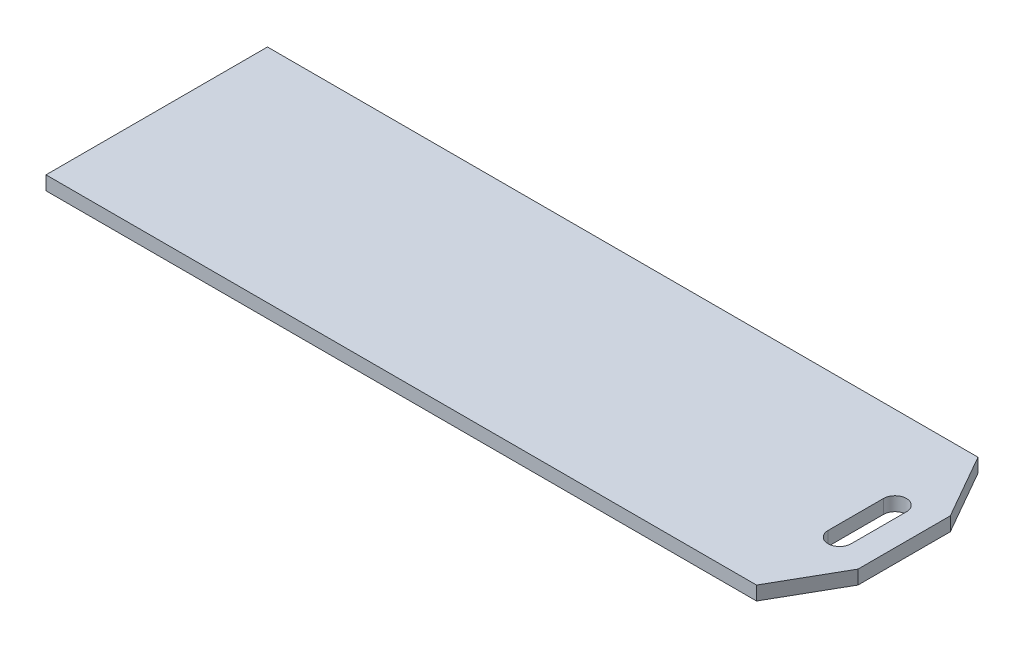
ISO-10303-21;
HEADER;
FILE_DESCRIPTION(('STEP AP214'),'2;1');
FILE_NAME('part.step','',(''),(''),'','','');
FILE_SCHEMA(('AUTOMOTIVE_DESIGN { 1 0 10303 214 1 1 1 1 }'));
ENDSEC;
DATA;
#1=APPLICATION_CONTEXT('core data for automotive mechanical design processes');
#2=APPLICATION_PROTOCOL_DEFINITION('international standard','automotive_design',2000,#1);
#3=PRODUCT_CONTEXT('',#1,'mechanical');
#4=PRODUCT('Part','Part','',(#3));
#5=PRODUCT_RELATED_PRODUCT_CATEGORY('part','',(#4));
#6=PRODUCT_DEFINITION_FORMATION('','',#4);
#7=PRODUCT_DEFINITION_CONTEXT('part definition',#1,'design');
#8=PRODUCT_DEFINITION('design','',#6,#7);
#9=PRODUCT_DEFINITION_SHAPE('','',#8);
#10=(LENGTH_UNIT() NAMED_UNIT(*) SI_UNIT(.MILLI.,.METRE.));
#11=(NAMED_UNIT(*) PLANE_ANGLE_UNIT() SI_UNIT($,.RADIAN.));
#12=(NAMED_UNIT(*) SI_UNIT($,.STERADIAN.) SOLID_ANGLE_UNIT());
#13=UNCERTAINTY_MEASURE_WITH_UNIT(LENGTH_MEASURE(1.E-05),#10,'distance_accuracy_value','');
#14=(GEOMETRIC_REPRESENTATION_CONTEXT(3) GLOBAL_UNCERTAINTY_ASSIGNED_CONTEXT((#13)) GLOBAL_UNIT_ASSIGNED_CONTEXT((#10,
#11,#12)) REPRESENTATION_CONTEXT('',''));
#15=CARTESIAN_POINT('',(0.,0.,0.));
#16=DIRECTION('',(0.,0.,1.));
#17=DIRECTION('',(1.,0.,0.));
#18=AXIS2_PLACEMENT_3D('',#15,#16,#17);
#19=CARTESIAN_POINT('',(0.,19.05,0.));
#20=DIRECTION('',(1.,0.,0.));
#21=DIRECTION('',(0.,0.,-1.));
#22=AXIS2_PLACEMENT_3D('',#19,#20,#21);
#23=PLANE('',#22);
#24=DIRECTION('',(0.,0.,1.));
#25=VECTOR('',#24,1.);
#26=CARTESIAN_POINT('',(0.,0.,0.));
#27=LINE('',#26,#25);
#28=CARTESIAN_POINT('',(0.,0.,0.));
#29=VERTEX_POINT('',#28);
#30=CARTESIAN_POINT('',(0.,0.,304.8));
#31=VERTEX_POINT('',#30);
#32=EDGE_CURVE('E146',#29,#31,#27,.T.);
#33=ORIENTED_EDGE('',*,*,#32,.T.);
#34=DIRECTION('',(0.,-1.,0.));
#35=VECTOR('',#34,1.);
#36=CARTESIAN_POINT('',(0.,19.05,304.8));
#37=LINE('',#36,#35);
#38=CARTESIAN_POINT('',(0.,19.05,304.8));
#39=VERTEX_POINT('',#38);
#40=EDGE_CURVE('E11',#39,#31,#37,.T.);
#41=ORIENTED_EDGE('',*,*,#40,.F.);
#42=DIRECTION('',(0.,0.,1.));
#43=VECTOR('',#42,1.);
#44=CARTESIAN_POINT('',(0.,19.05,0.));
#45=LINE('',#44,#43);
#46=CARTESIAN_POINT('',(0.,19.05,0.));
#47=VERTEX_POINT('',#46);
#48=EDGE_CURVE('E155',#47,#39,#45,.T.);
#49=ORIENTED_EDGE('',*,*,#48,.F.);
#50=DIRECTION('',(0.,-1.,0.));
#51=VECTOR('',#50,1.);
#52=CARTESIAN_POINT('',(0.,19.05,0.));
#53=LINE('',#52,#51);
#54=EDGE_CURVE('E167',#47,#29,#53,.T.);
#55=ORIENTED_EDGE('',*,*,#54,.T.);
#56=EDGE_LOOP('',(#33,#41,#49,#55));
#57=FACE_BOUND('',#56,.T.);
#58=ADVANCED_FACE('F39',(#57),#23,.F.);
#59=CARTESIAN_POINT('',(0.,19.05,304.8));
#60=DIRECTION('',(0.,0.,-1.));
#61=DIRECTION('',(-1.,0.,0.));
#62=AXIS2_PLACEMENT_3D('',#59,#60,#61);
#63=PLANE('',#62);
#64=DIRECTION('',(1.,0.,0.));
#65=VECTOR('',#64,1.);
#66=CARTESIAN_POINT('',(0.,0.,304.8));
#67=LINE('',#66,#65);
#68=CARTESIAN_POINT('',(977.9,0.,304.8));
#69=VERTEX_POINT('',#68);
#70=EDGE_CURVE('E166',#31,#69,#67,.T.);
#71=ORIENTED_EDGE('',*,*,#70,.T.);
#72=DIRECTION('',(0.,-1.,0.));
#73=VECTOR('',#72,1.);
#74=CARTESIAN_POINT('',(977.9,19.05,304.8));
#75=LINE('',#74,#73);
#76=CARTESIAN_POINT('',(977.9,19.05,304.8));
#77=VERTEX_POINT('',#76);
#78=EDGE_CURVE('E46',#77,#69,#75,.T.);
#79=ORIENTED_EDGE('',*,*,#78,.F.);
#80=DIRECTION('',(1.,0.,0.));
#81=VECTOR('',#80,1.);
#82=CARTESIAN_POINT('',(0.,19.05,304.8));
#83=LINE('',#82,#81);
#84=EDGE_CURVE('E154',#39,#77,#83,.T.);
#85=ORIENTED_EDGE('',*,*,#84,.F.);
#86=ORIENTED_EDGE('',*,*,#40,.T.);
#87=EDGE_LOOP('',(#71,#79,#85,#86));
#88=FACE_BOUND('',#87,.T.);
#89=ADVANCED_FACE('F212',(#88),#63,.F.);
#90=CARTESIAN_POINT('',(1028.7,19.05,215.9));
#91=DIRECTION('',(-0.868243142124459,0.,-0.496138938356833));
#92=DIRECTION('',(-0.496138938356833,0.,0.86824314212446));
#93=AXIS2_PLACEMENT_3D('',#90,#91,#92);
#94=PLANE('',#93);
#95=DIRECTION('',(0.496138938356833,0.,-0.868243142124459));
#96=VECTOR('',#95,1.);
#97=CARTESIAN_POINT('',(1028.7,0.,215.9));
#98=LINE('',#97,#96);
#99=CARTESIAN_POINT('',(1028.7,0.,215.9));
#100=VERTEX_POINT('',#99);
#101=EDGE_CURVE('E172',#69,#100,#98,.T.);
#102=ORIENTED_EDGE('',*,*,#101,.T.);
#103=DIRECTION('',(0.,-1.,0.));
#104=VECTOR('',#103,1.);
#105=CARTESIAN_POINT('',(1028.7,19.05,215.9));
#106=LINE('',#105,#104);
#107=CARTESIAN_POINT('',(1028.7,19.05,215.9));
#108=VERTEX_POINT('',#107);
#109=EDGE_CURVE('E187',#108,#100,#106,.T.);
#110=ORIENTED_EDGE('',*,*,#109,.F.);
#111=DIRECTION('',(0.496138938356833,0.,-0.868243142124459));
#112=VECTOR('',#111,1.);
#113=CARTESIAN_POINT('',(1028.7,19.05,215.9));
#114=LINE('',#113,#112);
#115=EDGE_CURVE('E158',#77,#108,#114,.T.);
#116=ORIENTED_EDGE('',*,*,#115,.F.);
#117=ORIENTED_EDGE('',*,*,#78,.T.);
#118=EDGE_LOOP('',(#102,#110,#116,#117));
#119=FACE_BOUND('',#118,.T.);
#120=ADVANCED_FACE('F192',(#119),#94,.F.);
#121=CARTESIAN_POINT('',(1028.7,19.05,88.9));
#122=DIRECTION('',(-1.,0.,0.));
#123=DIRECTION('',(0.,0.,1.));
#124=AXIS2_PLACEMENT_3D('',#121,#122,#123);
#125=PLANE('',#124);
#126=DIRECTION('',(0.,0.,-1.));
#127=VECTOR('',#126,1.);
#128=CARTESIAN_POINT('',(1028.7,0.,88.9));
#129=LINE('',#128,#127);
#130=CARTESIAN_POINT('',(1028.7,0.,88.9));
#131=VERTEX_POINT('',#130);
#132=EDGE_CURVE('E174',#100,#131,#129,.T.);
#133=ORIENTED_EDGE('',*,*,#132,.T.);
#134=DIRECTION('',(0.,-1.,0.));
#135=VECTOR('',#134,1.);
#136=CARTESIAN_POINT('',(1028.7,19.05,88.9));
#137=LINE('',#136,#135);
#138=CARTESIAN_POINT('',(1028.7,19.05,88.9));
#139=VERTEX_POINT('',#138);
#140=EDGE_CURVE('E181',#139,#131,#137,.T.);
#141=ORIENTED_EDGE('',*,*,#140,.F.);
#142=DIRECTION('',(0.,0.,-1.));
#143=VECTOR('',#142,1.);
#144=CARTESIAN_POINT('',(1028.7,19.05,88.9));
#145=LINE('',#144,#143);
#146=EDGE_CURVE('E159',#108,#139,#145,.T.);
#147=ORIENTED_EDGE('',*,*,#146,.F.);
#148=ORIENTED_EDGE('',*,*,#109,.T.);
#149=EDGE_LOOP('',(#133,#141,#147,#148));
#150=FACE_BOUND('',#149,.T.);
#151=ADVANCED_FACE('F205',(#150),#125,.F.);
#152=CARTESIAN_POINT('',(977.9,19.05,0.));
#153=DIRECTION('',(-0.868243142124459,0.,0.496138938356834));
#154=DIRECTION('',(0.496138938356834,0.,0.86824314212446));
#155=AXIS2_PLACEMENT_3D('',#152,#153,#154);
#156=PLANE('',#155);
#157=DIRECTION('',(-0.496138938356834,0.,-0.868243142124459));
#158=VECTOR('',#157,1.);
#159=CARTESIAN_POINT('',(977.9,0.,0.));
#160=LINE('',#159,#158);
#161=CARTESIAN_POINT('',(977.9,0.,0.));
#162=VERTEX_POINT('',#161);
#163=EDGE_CURVE('E173',#131,#162,#160,.T.);
#164=ORIENTED_EDGE('',*,*,#163,.T.);
#165=DIRECTION('',(0.,-1.,0.));
#166=VECTOR('',#165,1.);
#167=CARTESIAN_POINT('',(977.9,19.05,0.));
#168=LINE('',#167,#166);
#169=CARTESIAN_POINT('',(977.9,19.05,0.));
#170=VERTEX_POINT('',#169);
#171=EDGE_CURVE('E179',#170,#162,#168,.T.);
#172=ORIENTED_EDGE('',*,*,#171,.F.);
#173=DIRECTION('',(-0.496138938356834,0.,-0.868243142124459));
#174=VECTOR('',#173,1.);
#175=CARTESIAN_POINT('',(977.9,19.05,0.));
#176=LINE('',#175,#174);
#177=EDGE_CURVE('E165',#139,#170,#176,.T.);
#178=ORIENTED_EDGE('',*,*,#177,.F.);
#179=ORIENTED_EDGE('',*,*,#140,.T.);
#180=EDGE_LOOP('',(#164,#172,#178,#179));
#181=FACE_BOUND('',#180,.T.);
#182=ADVANCED_FACE('F206',(#181),#156,.F.);
#183=CARTESIAN_POINT('',(0.,19.05,0.));
#184=DIRECTION('',(0.,0.,1.));
#185=DIRECTION('',(1.,0.,0.));
#186=AXIS2_PLACEMENT_3D('',#183,#184,#185);
#187=PLANE('',#186);
#188=DIRECTION('',(-1.,0.,0.));
#189=VECTOR('',#188,1.);
#190=CARTESIAN_POINT('',(0.,0.,0.));
#191=LINE('',#190,#189);
#192=EDGE_CURVE('E156',#162,#29,#191,.T.);
#193=ORIENTED_EDGE('',*,*,#192,.T.);
#194=ORIENTED_EDGE('',*,*,#54,.F.);
#195=DIRECTION('',(-1.,0.,0.));
#196=VECTOR('',#195,1.);
#197=CARTESIAN_POINT('',(0.,19.05,0.));
#198=LINE('',#197,#196);
#199=EDGE_CURVE('E163',#170,#47,#198,.T.);
#200=ORIENTED_EDGE('',*,*,#199,.F.);
#201=ORIENTED_EDGE('',*,*,#171,.T.);
#202=EDGE_LOOP('',(#193,#194,#200,#201));
#203=FACE_BOUND('',#202,.T.);
#204=ADVANCED_FACE('F220',(#203),#187,.F.);
#205=CARTESIAN_POINT('',(0.,19.05,0.));
#206=DIRECTION('',(0.,1.,0.));
#207=DIRECTION('',(0.,0.,1.));
#208=AXIS2_PLACEMENT_3D('',#205,#206,#207);
#209=PLANE('',#208);
#210=CARTESIAN_POINT('',(977.9,19.05,114.3));
#211=DIRECTION('',(0.,1.,0.));
#212=DIRECTION('',(0.,0.,1.));
#213=AXIS2_PLACEMENT_3D('',#210,#211,#212);
#214=CIRCLE('',#213,15.875);
#215=CARTESIAN_POINT('',(993.775,19.05,114.3));
#216=VERTEX_POINT('',#215);
#217=CARTESIAN_POINT('',(962.025,19.05,114.3));
#218=VERTEX_POINT('',#217);
#219=EDGE_CURVE('E52',#216,#218,#214,.T.);
#220=ORIENTED_EDGE('',*,*,#219,.F.);
#221=DIRECTION('',(0.,0.,-1.));
#222=VECTOR('',#221,1.);
#223=CARTESIAN_POINT('',(993.775,19.05,114.3));
#224=LINE('',#223,#222);
#225=CARTESIAN_POINT('',(993.775,19.05,190.5));
#226=VERTEX_POINT('',#225);
#227=EDGE_CURVE('E134',#226,#216,#224,.T.);
#228=ORIENTED_EDGE('',*,*,#227,.F.);
#229=CARTESIAN_POINT('',(977.9,19.05,190.5));
#230=DIRECTION('',(0.,1.,0.));
#231=DIRECTION('',(0.,0.,1.));
#232=AXIS2_PLACEMENT_3D('',#229,#230,#231);
#233=CIRCLE('',#232,15.875);
#234=CARTESIAN_POINT('',(962.025,19.05,190.5));
#235=VERTEX_POINT('',#234);
#236=EDGE_CURVE('E136',#235,#226,#233,.T.);
#237=ORIENTED_EDGE('',*,*,#236,.F.);
#238=DIRECTION('',(0.,0.,1.));
#239=VECTOR('',#238,1.);
#240=CARTESIAN_POINT('',(962.025,19.05,114.3));
#241=LINE('',#240,#239);
#242=EDGE_CURVE('E142',#218,#235,#241,.T.);
#243=ORIENTED_EDGE('',*,*,#242,.F.);
#244=EDGE_LOOP('',(#220,#228,#237,#243));
#245=FACE_BOUND('',#244,.T.);
#246=ORIENTED_EDGE('',*,*,#48,.T.);
#247=ORIENTED_EDGE('',*,*,#84,.T.);
#248=ORIENTED_EDGE('',*,*,#115,.T.);
#249=ORIENTED_EDGE('',*,*,#146,.T.);
#250=ORIENTED_EDGE('',*,*,#177,.T.);
#251=ORIENTED_EDGE('',*,*,#199,.T.);
#252=EDGE_LOOP('',(#246,#247,#248,#249,#250,#251));
#253=FACE_BOUND('',#252,.T.);
#254=ADVANCED_FACE('F209',(#245,#253),#209,.T.);
#255=CARTESIAN_POINT('',(0.,0.,0.));
#256=DIRECTION('',(0.,1.,0.));
#257=DIRECTION('',(0.,0.,1.));
#258=AXIS2_PLACEMENT_3D('',#255,#256,#257);
#259=PLANE('',#258);
#260=DIRECTION('',(0.,0.,-1.));
#261=VECTOR('',#260,1.);
#262=CARTESIAN_POINT('',(993.775,0.,114.3));
#263=LINE('',#262,#261);
#264=CARTESIAN_POINT('',(993.775,0.,190.5));
#265=VERTEX_POINT('',#264);
#266=CARTESIAN_POINT('',(993.775,0.,114.3));
#267=VERTEX_POINT('',#266);
#268=EDGE_CURVE('E122',#265,#267,#263,.T.);
#269=ORIENTED_EDGE('',*,*,#268,.T.);
#270=CARTESIAN_POINT('',(977.9,0.,114.3));
#271=DIRECTION('',(0.,1.,0.));
#272=DIRECTION('',(0.,0.,1.));
#273=AXIS2_PLACEMENT_3D('',#270,#271,#272);
#274=CIRCLE('',#273,15.875);
#275=CARTESIAN_POINT('',(962.025,0.,114.3));
#276=VERTEX_POINT('',#275);
#277=EDGE_CURVE('E120',#267,#276,#274,.T.);
#278=ORIENTED_EDGE('',*,*,#277,.T.);
#279=DIRECTION('',(0.,0.,1.));
#280=VECTOR('',#279,1.);
#281=CARTESIAN_POINT('',(962.025,0.,114.3));
#282=LINE('',#281,#280);
#283=CARTESIAN_POINT('',(962.025,0.,190.5));
#284=VERTEX_POINT('',#283);
#285=EDGE_CURVE('E127',#276,#284,#282,.T.);
#286=ORIENTED_EDGE('',*,*,#285,.T.);
#287=CARTESIAN_POINT('',(977.9,0.,190.5));
#288=DIRECTION('',(0.,1.,0.));
#289=DIRECTION('',(0.,0.,1.));
#290=AXIS2_PLACEMENT_3D('',#287,#288,#289);
#291=CIRCLE('',#290,15.875);
#292=EDGE_CURVE('E62',#284,#265,#291,.T.);
#293=ORIENTED_EDGE('',*,*,#292,.T.);
#294=EDGE_LOOP('',(#269,#278,#286,#293));
#295=FACE_BOUND('',#294,.T.);
#296=ORIENTED_EDGE('',*,*,#32,.F.);
#297=ORIENTED_EDGE('',*,*,#192,.F.);
#298=ORIENTED_EDGE('',*,*,#163,.F.);
#299=ORIENTED_EDGE('',*,*,#132,.F.);
#300=ORIENTED_EDGE('',*,*,#101,.F.);
#301=ORIENTED_EDGE('',*,*,#70,.F.);
#302=EDGE_LOOP('',(#296,#297,#298,#299,#300,#301));
#303=FACE_BOUND('',#302,.T.);
#304=ADVANCED_FACE('F128',(#295,#303),#259,.F.);
#305=CARTESIAN_POINT('',(977.9,0.,114.3));
#306=DIRECTION('',(0.,1.,0.));
#307=DIRECTION('',(0.,0.,1.));
#308=AXIS2_PLACEMENT_3D('',#305,#306,#307);
#309=CYLINDRICAL_SURFACE('',#308,15.875);
#310=ORIENTED_EDGE('',*,*,#219,.T.);
#311=DIRECTION('',(0.,1.,0.));
#312=VECTOR('',#311,1.);
#313=CARTESIAN_POINT('',(962.025,0.,114.3));
#314=LINE('',#313,#312);
#315=EDGE_CURVE('E114',#276,#218,#314,.T.);
#316=ORIENTED_EDGE('',*,*,#315,.F.);
#317=ORIENTED_EDGE('',*,*,#277,.F.);
#318=DIRECTION('',(0.,1.,0.));
#319=VECTOR('',#318,1.);
#320=CARTESIAN_POINT('',(993.775,0.,114.3));
#321=LINE('',#320,#319);
#322=EDGE_CURVE('E148',#267,#216,#321,.T.);
#323=ORIENTED_EDGE('',*,*,#322,.T.);
#324=EDGE_LOOP('',(#310,#316,#317,#323));
#325=FACE_BOUND('',#324,.T.);
#326=ADVANCED_FACE('F113',(#325),#309,.F.);
#327=CARTESIAN_POINT('',(993.775,0.,114.3));
#328=DIRECTION('',(1.,0.,0.));
#329=DIRECTION('',(0.,0.,-1.));
#330=AXIS2_PLACEMENT_3D('',#327,#328,#329);
#331=PLANE('',#330);
#332=ORIENTED_EDGE('',*,*,#227,.T.);
#333=ORIENTED_EDGE('',*,*,#322,.F.);
#334=ORIENTED_EDGE('',*,*,#268,.F.);
#335=DIRECTION('',(0.,1.,0.));
#336=VECTOR('',#335,1.);
#337=CARTESIAN_POINT('',(993.775,0.,190.5));
#338=LINE('',#337,#336);
#339=EDGE_CURVE('E149',#265,#226,#338,.T.);
#340=ORIENTED_EDGE('',*,*,#339,.T.);
#341=EDGE_LOOP('',(#332,#333,#334,#340));
#342=FACE_BOUND('',#341,.T.);
#343=ADVANCED_FACE('F273',(#342),#331,.F.);
#344=CARTESIAN_POINT('',(977.9,0.,190.5));
#345=DIRECTION('',(0.,1.,0.));
#346=DIRECTION('',(0.,0.,1.));
#347=AXIS2_PLACEMENT_3D('',#344,#345,#346);
#348=CYLINDRICAL_SURFACE('',#347,15.875);
#349=ORIENTED_EDGE('',*,*,#236,.T.);
#350=ORIENTED_EDGE('',*,*,#339,.F.);
#351=ORIENTED_EDGE('',*,*,#292,.F.);
#352=DIRECTION('',(0.,1.,0.));
#353=VECTOR('',#352,1.);
#354=CARTESIAN_POINT('',(962.025,0.,190.5));
#355=LINE('',#354,#353);
#356=EDGE_CURVE('E125',#284,#235,#355,.T.);
#357=ORIENTED_EDGE('',*,*,#356,.T.);
#358=EDGE_LOOP('',(#349,#350,#351,#357));
#359=FACE_BOUND('',#358,.T.);
#360=ADVANCED_FACE('F284',(#359),#348,.F.);
#361=CARTESIAN_POINT('',(962.025,0.,114.3));
#362=DIRECTION('',(-1.,0.,0.));
#363=DIRECTION('',(0.,0.,1.));
#364=AXIS2_PLACEMENT_3D('',#361,#362,#363);
#365=PLANE('',#364);
#366=ORIENTED_EDGE('',*,*,#242,.T.);
#367=ORIENTED_EDGE('',*,*,#356,.F.);
#368=ORIENTED_EDGE('',*,*,#285,.F.);
#369=ORIENTED_EDGE('',*,*,#315,.T.);
#370=EDGE_LOOP('',(#366,#367,#368,#369));
#371=FACE_BOUND('',#370,.T.);
#372=ADVANCED_FACE('F130',(#371),#365,.F.);
#373=CLOSED_SHELL('',(#58,#89,#120,#151,#182,#204,#254,#304,#326,#343,#360,#372));
#374=MANIFOLD_SOLID_BREP('B2',#373);
#375=ADVANCED_BREP_SHAPE_REPRESENTATION('',(#18,#374),#14);
#376=SHAPE_DEFINITION_REPRESENTATION(#9,#375);
ENDSEC;
END-ISO-10303-21;
